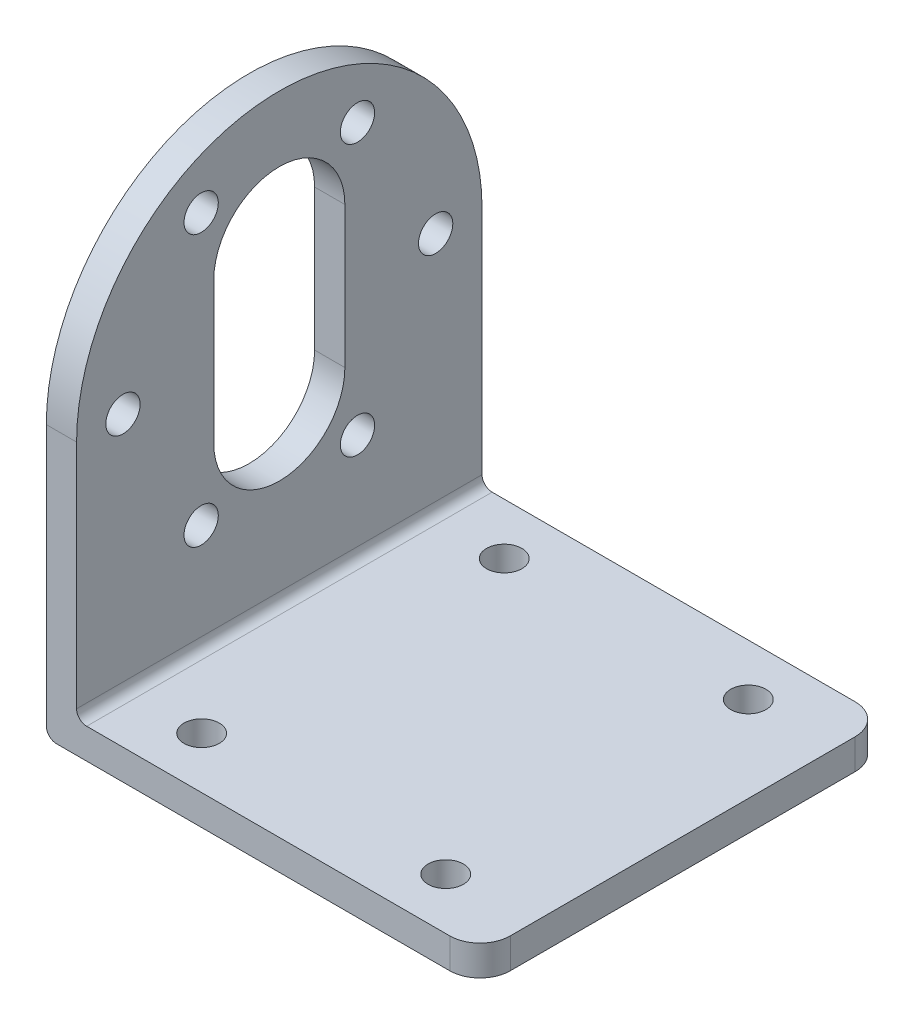
ISO-10303-21;
HEADER;
FILE_DESCRIPTION(('STEP AP214'),'2;1');
FILE_NAME('part.step','',(''),(''),'','','');
FILE_SCHEMA(('AUTOMOTIVE_DESIGN { 1 0 10303 214 1 1 1 1 }'));
ENDSEC;
DATA;
#1=APPLICATION_CONTEXT('core data for automotive mechanical design processes');
#2=APPLICATION_PROTOCOL_DEFINITION('international standard','automotive_design',2000,#1);
#3=PRODUCT_CONTEXT('',#1,'mechanical');
#4=PRODUCT('Part','Part','',(#3));
#5=PRODUCT_RELATED_PRODUCT_CATEGORY('part','',(#4));
#6=PRODUCT_DEFINITION_FORMATION('','',#4);
#7=PRODUCT_DEFINITION_CONTEXT('part definition',#1,'design');
#8=PRODUCT_DEFINITION('design','',#6,#7);
#9=PRODUCT_DEFINITION_SHAPE('','',#8);
#10=(LENGTH_UNIT() NAMED_UNIT(*) SI_UNIT(.MILLI.,.METRE.));
#11=(NAMED_UNIT(*) PLANE_ANGLE_UNIT() SI_UNIT($,.RADIAN.));
#12=(NAMED_UNIT(*) SI_UNIT($,.STERADIAN.) SOLID_ANGLE_UNIT());
#13=UNCERTAINTY_MEASURE_WITH_UNIT(LENGTH_MEASURE(1.E-05),#10,'distance_accuracy_value','');
#14=(GEOMETRIC_REPRESENTATION_CONTEXT(3) GLOBAL_UNCERTAINTY_ASSIGNED_CONTEXT((#13)) GLOBAL_UNIT_ASSIGNED_CONTEXT((#10,
#11,#12)) REPRESENTATION_CONTEXT('',''));
#15=CARTESIAN_POINT('',(0.,0.,0.));
#16=DIRECTION('',(0.,0.,1.));
#17=DIRECTION('',(1.,0.,0.));
#18=AXIS2_PLACEMENT_3D('',#15,#16,#17);
#19=CARTESIAN_POINT('',(43.,0.,0.));
#20=DIRECTION('',(0.,-1.,0.));
#21=DIRECTION('',(0.,0.,-1.));
#22=AXIS2_PLACEMENT_3D('',#19,#20,#21);
#23=PLANE('',#22);
#24=CARTESIAN_POINT('',(34.5,0.,35.1));
#25=DIRECTION('',(0.,-1.,0.));
#26=DIRECTION('',(0.,0.,-1.));
#27=AXIS2_PLACEMENT_3D('',#24,#25,#26);
#28=CIRCLE('',#27,1.75);
#29=CARTESIAN_POINT('',(34.5,0.,33.35));
#30=VERTEX_POINT('',#29);
#31=EDGE_CURVE('E11',#30,#30,#28,.T.);
#32=ORIENTED_EDGE('',*,*,#31,.F.);
#33=EDGE_LOOP('',(#32));
#34=FACE_BOUND('',#33,.T.);
#35=CARTESIAN_POINT('',(10.3,0.,5.09999999999999));
#36=DIRECTION('',(0.,-1.,0.));
#37=DIRECTION('',(0.,0.,-1.));
#38=AXIS2_PLACEMENT_3D('',#35,#36,#37);
#39=CIRCLE('',#38,1.75);
#40=CARTESIAN_POINT('',(10.3,0.,3.34999999999999));
#41=VERTEX_POINT('',#40);
#42=EDGE_CURVE('E24',#41,#41,#39,.T.);
#43=ORIENTED_EDGE('',*,*,#42,.F.);
#44=EDGE_LOOP('',(#43));
#45=FACE_BOUND('',#44,.T.);
#46=CARTESIAN_POINT('',(10.3,0.,35.1));
#47=DIRECTION('',(0.,-1.,0.));
#48=DIRECTION('',(0.,0.,-1.));
#49=AXIS2_PLACEMENT_3D('',#46,#47,#48);
#50=CIRCLE('',#49,1.75);
#51=CARTESIAN_POINT('',(10.3,0.,33.35));
#52=VERTEX_POINT('',#51);
#53=EDGE_CURVE('E286',#52,#52,#50,.T.);
#54=ORIENTED_EDGE('',*,*,#53,.F.);
#55=EDGE_LOOP('',(#54));
#56=FACE_BOUND('',#55,.T.);
#57=CARTESIAN_POINT('',(34.5,0.,5.1));
#58=DIRECTION('',(0.,-1.,0.));
#59=DIRECTION('',(0.,0.,-1.));
#60=AXIS2_PLACEMENT_3D('',#57,#58,#59);
#61=CIRCLE('',#60,1.75);
#62=CARTESIAN_POINT('',(34.5,0.,3.35));
#63=VERTEX_POINT('',#62);
#64=EDGE_CURVE('E283',#63,#63,#61,.T.);
#65=ORIENTED_EDGE('',*,*,#64,.F.);
#66=EDGE_LOOP('',(#65));
#67=FACE_BOUND('',#66,.T.);
#68=DIRECTION('',(0.,0.,1.));
#69=VECTOR('',#68,1.);
#70=CARTESIAN_POINT('',(43.,0.,0.));
#71=LINE('',#70,#69);
#72=CARTESIAN_POINT('',(43.,0.,3.));
#73=VERTEX_POINT('',#72);
#74=CARTESIAN_POINT('',(43.,0.,37.2));
#75=VERTEX_POINT('',#74);
#76=EDGE_CURVE('E31',#73,#75,#71,.T.);
#77=ORIENTED_EDGE('',*,*,#76,.T.);
#78=CARTESIAN_POINT('',(40.,0.,37.2));
#79=DIRECTION('',(0.,-1.,0.));
#80=DIRECTION('',(0.,0.,-1.));
#81=AXIS2_PLACEMENT_3D('',#78,#79,#80);
#82=CIRCLE('',#81,3.);
#83=CARTESIAN_POINT('',(40.,0.,40.2));
#84=VERTEX_POINT('',#83);
#85=EDGE_CURVE('E36',#75,#84,#82,.T.);
#86=ORIENTED_EDGE('',*,*,#85,.T.);
#87=DIRECTION('',(-1.,0.,0.));
#88=VECTOR('',#87,1.);
#89=CARTESIAN_POINT('',(43.,0.,40.2));
#90=LINE('',#89,#88);
#91=CARTESIAN_POINT('',(1.,0.,40.2));
#92=VERTEX_POINT('',#91);
#93=EDGE_CURVE('E279',#84,#92,#90,.T.);
#94=ORIENTED_EDGE('',*,*,#93,.T.);
#95=DIRECTION('',(0.,0.,1.));
#96=VECTOR('',#95,1.);
#97=CARTESIAN_POINT('',(1.,0.,0.));
#98=LINE('',#97,#96);
#99=CARTESIAN_POINT('',(1.,0.,0.));
#100=VERTEX_POINT('',#99);
#101=EDGE_CURVE('E277',#92,#100,#98,.F.);
#102=ORIENTED_EDGE('',*,*,#101,.T.);
#103=DIRECTION('',(-1.,0.,0.));
#104=VECTOR('',#103,1.);
#105=CARTESIAN_POINT('',(43.,0.,0.));
#106=LINE('',#105,#104);
#107=CARTESIAN_POINT('',(40.,0.,0.));
#108=VERTEX_POINT('',#107);
#109=EDGE_CURVE('E274',#108,#100,#106,.T.);
#110=ORIENTED_EDGE('',*,*,#109,.F.);
#111=CARTESIAN_POINT('',(40.,0.,3.));
#112=DIRECTION('',(0.,-1.,0.));
#113=DIRECTION('',(0.,0.,-1.));
#114=AXIS2_PLACEMENT_3D('',#111,#112,#113);
#115=CIRCLE('',#114,3.);
#116=EDGE_CURVE('E272',#108,#73,#115,.T.);
#117=ORIENTED_EDGE('',*,*,#116,.T.);
#118=EDGE_LOOP('',(#77,#86,#94,#102,#110,#117));
#119=FACE_BOUND('',#118,.T.);
#120=ADVANCED_FACE('F17',(#34,#45,#56,#67,#119),#23,.T.);
#121=CARTESIAN_POINT('',(43.,26.9,0.));
#122=DIRECTION('',(0.,0.,-1.));
#123=DIRECTION('',(-1.,0.,0.));
#124=AXIS2_PLACEMENT_3D('',#121,#122,#123);
#125=PLANE('',#124);
#126=DIRECTION('',(-1.,0.,0.));
#127=VECTOR('',#126,1.);
#128=CARTESIAN_POINT('',(59.2917047559601,3.,0.));
#129=LINE('',#128,#127);
#130=CARTESIAN_POINT('',(40.,3.,0.));
#131=VERTEX_POINT('',#130);
#132=CARTESIAN_POINT('',(4.,3.,0.));
#133=VERTEX_POINT('',#132);
#134=EDGE_CURVE('E269',#131,#133,#129,.T.);
#135=ORIENTED_EDGE('',*,*,#134,.F.);
#136=DIRECTION('',(0.,-1.,0.));
#137=VECTOR('',#136,1.);
#138=CARTESIAN_POINT('',(40.,0.,0.));
#139=LINE('',#138,#137);
#140=EDGE_CURVE('E266',#131,#108,#139,.T.);
#141=ORIENTED_EDGE('',*,*,#140,.T.);
#142=ORIENTED_EDGE('',*,*,#109,.T.);
#143=CARTESIAN_POINT('',(1.,1.,0.));
#144=DIRECTION('',(0.,0.,-1.));
#145=DIRECTION('',(-1.,0.,0.));
#146=AXIS2_PLACEMENT_3D('',#143,#144,#145);
#147=CIRCLE('',#146,1.);
#148=CARTESIAN_POINT('',(0.,1.00000000000001,0.));
#149=VERTEX_POINT('',#148);
#150=EDGE_CURVE('E264',#100,#149,#147,.T.);
#151=ORIENTED_EDGE('',*,*,#150,.T.);
#152=DIRECTION('',(0.,-1.,0.));
#153=VECTOR('',#152,1.);
#154=CARTESIAN_POINT('',(0.,26.9,0.));
#155=LINE('',#154,#153);
#156=CARTESIAN_POINT('',(0.,26.9,0.));
#157=VERTEX_POINT('',#156);
#158=EDGE_CURVE('E261',#157,#149,#155,.T.);
#159=ORIENTED_EDGE('',*,*,#158,.F.);
#160=DIRECTION('',(-1.,0.,0.));
#161=VECTOR('',#160,1.);
#162=CARTESIAN_POINT('',(43.,26.9,0.));
#163=LINE('',#162,#161);
#164=CARTESIAN_POINT('',(3.,26.9,0.));
#165=VERTEX_POINT('',#164);
#166=EDGE_CURVE('E258',#165,#157,#163,.T.);
#167=ORIENTED_EDGE('',*,*,#166,.F.);
#168=DIRECTION('',(0.,1.,0.));
#169=VECTOR('',#168,1.);
#170=CARTESIAN_POINT('',(3.,3.,0.));
#171=LINE('',#170,#169);
#172=CARTESIAN_POINT('',(3.,4.,0.));
#173=VERTEX_POINT('',#172);
#174=EDGE_CURVE('E255',#173,#165,#171,.T.);
#175=ORIENTED_EDGE('',*,*,#174,.F.);
#176=CARTESIAN_POINT('',(4.,4.,0.));
#177=DIRECTION('',(0.,0.,-1.));
#178=DIRECTION('',(-1.,0.,0.));
#179=AXIS2_PLACEMENT_3D('',#176,#177,#178);
#180=CIRCLE('',#179,1.);
#181=EDGE_CURVE('E253',#173,#133,#180,.F.);
#182=ORIENTED_EDGE('',*,*,#181,.T.);
#183=EDGE_LOOP('',(#135,#141,#142,#151,#159,#167,#175,#182));
#184=FACE_BOUND('',#183,.T.);
#185=ADVANCED_FACE('F295',(#184),#125,.T.);
#186=CARTESIAN_POINT('',(43.,26.9,20.1));
#187=DIRECTION('',(-1.,0.,0.));
#188=DIRECTION('',(0.,0.,1.));
#189=AXIS2_PLACEMENT_3D('',#186,#187,#188);
#190=CYLINDRICAL_SURFACE('',#189,20.1);
#191=CARTESIAN_POINT('',(3.,26.9,20.1));
#192=DIRECTION('',(-1.,0.,0.));
#193=DIRECTION('',(0.,-1.,0.));
#194=AXIS2_PLACEMENT_3D('',#191,#192,#193);
#195=CIRCLE('',#194,20.1);
#196=CARTESIAN_POINT('',(3.,26.9,40.2));
#197=VERTEX_POINT('',#196);
#198=EDGE_CURVE('E250',#165,#197,#195,.F.);
#199=ORIENTED_EDGE('',*,*,#198,.F.);
#200=ORIENTED_EDGE('',*,*,#166,.T.);
#201=CARTESIAN_POINT('',(0.,26.9,20.1));
#202=DIRECTION('',(-1.,0.,0.));
#203=DIRECTION('',(0.,0.,1.));
#204=AXIS2_PLACEMENT_3D('',#201,#202,#203);
#205=CIRCLE('',#204,20.1);
#206=CARTESIAN_POINT('',(0.,26.9,40.2));
#207=VERTEX_POINT('',#206);
#208=EDGE_CURVE('E247',#207,#157,#205,.T.);
#209=ORIENTED_EDGE('',*,*,#208,.F.);
#210=DIRECTION('',(-1.,0.,0.));
#211=VECTOR('',#210,1.);
#212=CARTESIAN_POINT('',(43.,26.9,40.2));
#213=LINE('',#212,#211);
#214=EDGE_CURVE('E244',#197,#207,#213,.T.);
#215=ORIENTED_EDGE('',*,*,#214,.F.);
#216=EDGE_LOOP('',(#199,#200,#209,#215));
#217=FACE_BOUND('',#216,.T.);
#218=ADVANCED_FACE('F345',(#217),#190,.T.);
#219=CARTESIAN_POINT('',(43.,0.,40.2));
#220=DIRECTION('',(0.,0.,1.));
#221=DIRECTION('',(1.,0.,0.));
#222=AXIS2_PLACEMENT_3D('',#219,#220,#221);
#223=PLANE('',#222);
#224=ORIENTED_EDGE('',*,*,#93,.F.);
#225=DIRECTION('',(0.,1.,0.));
#226=VECTOR('',#225,1.);
#227=CARTESIAN_POINT('',(40.,3.,40.2));
#228=LINE('',#227,#226);
#229=CARTESIAN_POINT('',(40.,3.,40.2));
#230=VERTEX_POINT('',#229);
#231=EDGE_CURVE('E242',#84,#230,#228,.T.);
#232=ORIENTED_EDGE('',*,*,#231,.T.);
#233=DIRECTION('',(-1.,0.,0.));
#234=VECTOR('',#233,1.);
#235=CARTESIAN_POINT('',(59.2917047559601,3.,40.2));
#236=LINE('',#235,#234);
#237=CARTESIAN_POINT('',(4.,3.,40.2));
#238=VERTEX_POINT('',#237);
#239=EDGE_CURVE('E240',#230,#238,#236,.T.);
#240=ORIENTED_EDGE('',*,*,#239,.T.);
#241=CARTESIAN_POINT('',(4.,4.,40.2));
#242=DIRECTION('',(0.,0.,1.));
#243=DIRECTION('',(1.,0.,0.));
#244=AXIS2_PLACEMENT_3D('',#241,#242,#243);
#245=CIRCLE('',#244,1.);
#246=CARTESIAN_POINT('',(3.,4.,40.2));
#247=VERTEX_POINT('',#246);
#248=EDGE_CURVE('E238',#238,#247,#245,.F.);
#249=ORIENTED_EDGE('',*,*,#248,.T.);
#250=DIRECTION('',(0.,1.,0.));
#251=VECTOR('',#250,1.);
#252=CARTESIAN_POINT('',(3.,3.,40.2));
#253=LINE('',#252,#251);
#254=EDGE_CURVE('E235',#247,#197,#253,.T.);
#255=ORIENTED_EDGE('',*,*,#254,.T.);
#256=ORIENTED_EDGE('',*,*,#214,.T.);
#257=DIRECTION('',(0.,1.,0.));
#258=VECTOR('',#257,1.);
#259=CARTESIAN_POINT('',(0.,0.,40.2));
#260=LINE('',#259,#258);
#261=CARTESIAN_POINT('',(0.,1.,40.2));
#262=VERTEX_POINT('',#261);
#263=EDGE_CURVE('E232',#262,#207,#260,.T.);
#264=ORIENTED_EDGE('',*,*,#263,.F.);
#265=CARTESIAN_POINT('',(1.,1.,40.2));
#266=DIRECTION('',(0.,0.,1.));
#267=DIRECTION('',(1.,0.,0.));
#268=AXIS2_PLACEMENT_3D('',#265,#266,#267);
#269=CIRCLE('',#268,1.);
#270=EDGE_CURVE('E229',#262,#92,#269,.T.);
#271=ORIENTED_EDGE('',*,*,#270,.T.);
#272=EDGE_LOOP('',(#224,#232,#240,#249,#255,#256,#264,#271));
#273=FACE_BOUND('',#272,.T.);
#274=ADVANCED_FACE('F341',(#273),#223,.T.);
#275=CARTESIAN_POINT('',(43.,26.9,20.1));
#276=DIRECTION('',(-1.,0.,0.));
#277=DIRECTION('',(0.,0.,1.));
#278=AXIS2_PLACEMENT_3D('',#275,#276,#277);
#279=PLANE('',#278);
#280=DIRECTION('',(0.,0.,1.));
#281=VECTOR('',#280,1.);
#282=CARTESIAN_POINT('',(43.,3.,20.1));
#283=LINE('',#282,#281);
#284=CARTESIAN_POINT('',(43.,3.,3.));
#285=VERTEX_POINT('',#284);
#286=CARTESIAN_POINT('',(43.,3.,37.2));
#287=VERTEX_POINT('',#286);
#288=EDGE_CURVE('E227',#285,#287,#283,.T.);
#289=ORIENTED_EDGE('',*,*,#288,.T.);
#290=DIRECTION('',(0.,1.,0.));
#291=VECTOR('',#290,1.);
#292=CARTESIAN_POINT('',(43.,0.,37.2));
#293=LINE('',#292,#291);
#294=EDGE_CURVE('E225',#287,#75,#293,.F.);
#295=ORIENTED_EDGE('',*,*,#294,.T.);
#296=ORIENTED_EDGE('',*,*,#76,.F.);
#297=DIRECTION('',(0.,-1.,0.));
#298=VECTOR('',#297,1.);
#299=CARTESIAN_POINT('',(43.,3.,3.));
#300=LINE('',#299,#298);
#301=EDGE_CURVE('E223',#73,#285,#300,.F.);
#302=ORIENTED_EDGE('',*,*,#301,.T.);
#303=EDGE_LOOP('',(#289,#295,#296,#302));
#304=FACE_BOUND('',#303,.T.);
#305=ADVANCED_FACE('F337',(#304),#279,.F.);
#306=CARTESIAN_POINT('',(0.,26.9,20.1));
#307=DIRECTION('',(-1.,0.,0.));
#308=DIRECTION('',(0.,0.,1.));
#309=AXIS2_PLACEMENT_3D('',#306,#307,#308);
#310=PLANE('',#309);
#311=CARTESIAN_POINT('',(0.,27.,4.6));
#312=DIRECTION('',(-1.,0.,0.));
#313=DIRECTION('',(0.,0.,1.));
#314=AXIS2_PLACEMENT_3D('',#311,#312,#313);
#315=CIRCLE('',#314,1.69999999999999);
#316=CARTESIAN_POINT('',(0.,27.,6.29999999999999));
#317=VERTEX_POINT('',#316);
#318=EDGE_CURVE('E220',#317,#317,#315,.T.);
#319=ORIENTED_EDGE('',*,*,#318,.F.);
#320=EDGE_LOOP('',(#319));
#321=FACE_BOUND('',#320,.T.);
#322=CARTESIAN_POINT('',(0.,40.4233937586588,12.35));
#323=DIRECTION('',(-1.,0.,0.));
#324=DIRECTION('',(0.,0.,1.));
#325=AXIS2_PLACEMENT_3D('',#322,#323,#324);
#326=CIRCLE('',#325,1.69999999999999);
#327=CARTESIAN_POINT('',(0.,40.4233937586588,14.05));
#328=VERTEX_POINT('',#327);
#329=EDGE_CURVE('E217',#328,#328,#326,.T.);
#330=ORIENTED_EDGE('',*,*,#329,.F.);
#331=EDGE_LOOP('',(#330));
#332=FACE_BOUND('',#331,.T.);
#333=CARTESIAN_POINT('',(0.,40.4233937586588,27.8500000000001));
#334=DIRECTION('',(-1.,0.,0.));
#335=DIRECTION('',(0.,0.,1.));
#336=AXIS2_PLACEMENT_3D('',#333,#334,#335);
#337=CIRCLE('',#336,1.69999999999999);
#338=CARTESIAN_POINT('',(0.,40.4233937586588,29.5500000000001));
#339=VERTEX_POINT('',#338);
#340=EDGE_CURVE('E214',#339,#339,#337,.T.);
#341=ORIENTED_EDGE('',*,*,#340,.F.);
#342=EDGE_LOOP('',(#341));
#343=FACE_BOUND('',#342,.T.);
#344=CARTESIAN_POINT('',(0.,26.9999999999999,35.6));
#345=DIRECTION('',(-1.,0.,0.));
#346=DIRECTION('',(0.,0.,1.));
#347=AXIS2_PLACEMENT_3D('',#344,#345,#346);
#348=CIRCLE('',#347,1.69999999999999);
#349=CARTESIAN_POINT('',(0.,26.9999999999999,37.3));
#350=VERTEX_POINT('',#349);
#351=EDGE_CURVE('E211',#350,#350,#348,.T.);
#352=ORIENTED_EDGE('',*,*,#351,.F.);
#353=EDGE_LOOP('',(#352));
#354=FACE_BOUND('',#353,.T.);
#355=CARTESIAN_POINT('',(0.,13.5766062413411,27.8499999999999));
#356=DIRECTION('',(-1.,0.,0.));
#357=DIRECTION('',(0.,0.,1.));
#358=AXIS2_PLACEMENT_3D('',#355,#356,#357);
#359=CIRCLE('',#358,1.69999999999999);
#360=CARTESIAN_POINT('',(0.,13.5766062413411,29.5499999999999));
#361=VERTEX_POINT('',#360);
#362=EDGE_CURVE('E208',#361,#361,#359,.T.);
#363=ORIENTED_EDGE('',*,*,#362,.F.);
#364=EDGE_LOOP('',(#363));
#365=FACE_BOUND('',#364,.T.);
#366=CARTESIAN_POINT('',(0.,13.5766062413413,12.3499999999998));
#367=DIRECTION('',(-1.,0.,0.));
#368=DIRECTION('',(0.,0.,1.));
#369=AXIS2_PLACEMENT_3D('',#366,#367,#368);
#370=CIRCLE('',#369,1.69999999999999);
#371=CARTESIAN_POINT('',(0.,13.5766062413413,14.0499999999998));
#372=VERTEX_POINT('',#371);
#373=EDGE_CURVE('E205',#372,#372,#370,.T.);
#374=ORIENTED_EDGE('',*,*,#373,.F.);
#375=EDGE_LOOP('',(#374));
#376=FACE_BOUND('',#375,.T.);
#377=CARTESIAN_POINT('',(0.,34.,20.1));
#378=DIRECTION('',(-1.,0.,0.));
#379=DIRECTION('',(0.,0.,1.));
#380=AXIS2_PLACEMENT_3D('',#377,#378,#379);
#381=CIRCLE('',#380,6.5);
#382=CARTESIAN_POINT('',(0.,34.,26.6));
#383=VERTEX_POINT('',#382);
#384=CARTESIAN_POINT('',(0.,34.,13.6));
#385=VERTEX_POINT('',#384);
#386=EDGE_CURVE('E202',#383,#385,#381,.T.);
#387=ORIENTED_EDGE('',*,*,#386,.F.);
#388=DIRECTION('',(0.,1.,0.));
#389=VECTOR('',#388,1.);
#390=CARTESIAN_POINT('',(0.,20.,26.6));
#391=LINE('',#390,#389);
#392=CARTESIAN_POINT('',(0.,20.,26.6));
#393=VERTEX_POINT('',#392);
#394=EDGE_CURVE('E200',#393,#383,#391,.T.);
#395=ORIENTED_EDGE('',*,*,#394,.F.);
#396=CARTESIAN_POINT('',(0.,20.,20.1));
#397=DIRECTION('',(-1.,0.,0.));
#398=DIRECTION('',(0.,0.,1.));
#399=AXIS2_PLACEMENT_3D('',#396,#397,#398);
#400=CIRCLE('',#399,6.5);
#401=CARTESIAN_POINT('',(0.,20.,13.6));
#402=VERTEX_POINT('',#401);
#403=EDGE_CURVE('E142',#402,#393,#400,.T.);
#404=ORIENTED_EDGE('',*,*,#403,.F.);
#405=DIRECTION('',(0.,-1.,0.));
#406=VECTOR('',#405,1.);
#407=CARTESIAN_POINT('',(0.,34.,13.6));
#408=LINE('',#407,#406);
#409=EDGE_CURVE('E196',#385,#402,#408,.T.);
#410=ORIENTED_EDGE('',*,*,#409,.F.);
#411=EDGE_LOOP('',(#387,#395,#404,#410));
#412=FACE_BOUND('',#411,.T.);
#413=ORIENTED_EDGE('',*,*,#158,.T.);
#414=DIRECTION('',(0.,0.,1.));
#415=VECTOR('',#414,1.);
#416=CARTESIAN_POINT('',(0.,1.,20.1));
#417=LINE('',#416,#415);
#418=EDGE_CURVE('E193',#149,#262,#417,.T.);
#419=ORIENTED_EDGE('',*,*,#418,.T.);
#420=ORIENTED_EDGE('',*,*,#263,.T.);
#421=ORIENTED_EDGE('',*,*,#208,.T.);
#422=EDGE_LOOP('',(#413,#419,#420,#421));
#423=FACE_BOUND('',#422,.T.);
#424=ADVANCED_FACE('F333',(#321,#332,#343,#354,#365,#376,#412,#423),#310,.T.);
#425=CARTESIAN_POINT('',(59.2917047559601,3.,40.2));
#426=DIRECTION('',(0.,-1.,0.));
#427=DIRECTION('',(0.,0.,-1.));
#428=AXIS2_PLACEMENT_3D('',#425,#426,#427);
#429=PLANE('',#428);
#430=CARTESIAN_POINT('',(34.5,3.,35.1));
#431=DIRECTION('',(0.,-1.,0.));
#432=DIRECTION('',(0.,0.,-1.));
#433=AXIS2_PLACEMENT_3D('',#430,#431,#432);
#434=CIRCLE('',#433,1.75);
#435=CARTESIAN_POINT('',(34.5,3.,33.35));
#436=VERTEX_POINT('',#435);
#437=EDGE_CURVE('E190',#436,#436,#434,.T.);
#438=ORIENTED_EDGE('',*,*,#437,.T.);
#439=EDGE_LOOP('',(#438));
#440=FACE_BOUND('',#439,.T.);
#441=CARTESIAN_POINT('',(10.3,3.,5.09999999999999));
#442=DIRECTION('',(0.,-1.,0.));
#443=DIRECTION('',(0.,0.,-1.));
#444=AXIS2_PLACEMENT_3D('',#441,#442,#443);
#445=CIRCLE('',#444,1.75);
#446=CARTESIAN_POINT('',(10.3,3.,3.34999999999999));
#447=VERTEX_POINT('',#446);
#448=EDGE_CURVE('E187',#447,#447,#445,.T.);
#449=ORIENTED_EDGE('',*,*,#448,.T.);
#450=EDGE_LOOP('',(#449));
#451=FACE_BOUND('',#450,.T.);
#452=CARTESIAN_POINT('',(10.3,3.,35.1));
#453=DIRECTION('',(0.,-1.,0.));
#454=DIRECTION('',(0.,0.,-1.));
#455=AXIS2_PLACEMENT_3D('',#452,#453,#454);
#456=CIRCLE('',#455,1.75);
#457=CARTESIAN_POINT('',(10.3,3.,33.35));
#458=VERTEX_POINT('',#457);
#459=EDGE_CURVE('E184',#458,#458,#456,.T.);
#460=ORIENTED_EDGE('',*,*,#459,.T.);
#461=EDGE_LOOP('',(#460));
#462=FACE_BOUND('',#461,.T.);
#463=CARTESIAN_POINT('',(34.5,3.,5.1));
#464=DIRECTION('',(0.,-1.,0.));
#465=DIRECTION('',(0.,0.,-1.));
#466=AXIS2_PLACEMENT_3D('',#463,#464,#465);
#467=CIRCLE('',#466,1.75);
#468=CARTESIAN_POINT('',(34.5,3.,3.35));
#469=VERTEX_POINT('',#468);
#470=EDGE_CURVE('E181',#469,#469,#467,.T.);
#471=ORIENTED_EDGE('',*,*,#470,.T.);
#472=EDGE_LOOP('',(#471));
#473=FACE_BOUND('',#472,.T.);
#474=ORIENTED_EDGE('',*,*,#239,.F.);
#475=CARTESIAN_POINT('',(40.,3.,37.2));
#476=DIRECTION('',(0.,-1.,0.));
#477=DIRECTION('',(0.,0.,-1.));
#478=AXIS2_PLACEMENT_3D('',#475,#476,#477);
#479=CIRCLE('',#478,3.);
#480=EDGE_CURVE('E178',#230,#287,#479,.F.);
#481=ORIENTED_EDGE('',*,*,#480,.T.);
#482=ORIENTED_EDGE('',*,*,#288,.F.);
#483=CARTESIAN_POINT('',(40.,3.,3.));
#484=DIRECTION('',(0.,-1.,0.));
#485=DIRECTION('',(0.,0.,-1.));
#486=AXIS2_PLACEMENT_3D('',#483,#484,#485);
#487=CIRCLE('',#486,3.);
#488=EDGE_CURVE('E175',#285,#131,#487,.F.);
#489=ORIENTED_EDGE('',*,*,#488,.T.);
#490=ORIENTED_EDGE('',*,*,#134,.T.);
#491=DIRECTION('',(0.,0.,-1.));
#492=VECTOR('',#491,1.);
#493=CARTESIAN_POINT('',(4.,3.,40.2));
#494=LINE('',#493,#492);
#495=EDGE_CURVE('E172',#133,#238,#494,.F.);
#496=ORIENTED_EDGE('',*,*,#495,.T.);
#497=EDGE_LOOP('',(#474,#481,#482,#489,#490,#496));
#498=FACE_BOUND('',#497,.T.);
#499=ADVANCED_FACE('F329',(#440,#451,#462,#473,#498),#429,.F.);
#500=CARTESIAN_POINT('',(3.,3.,40.2));
#501=DIRECTION('',(-1.,0.,0.));
#502=DIRECTION('',(0.,-1.,0.));
#503=AXIS2_PLACEMENT_3D('',#500,#501,#502);
#504=PLANE('',#503);
#505=CARTESIAN_POINT('',(3.,27.,4.6));
#506=DIRECTION('',(-1.,0.,0.));
#507=DIRECTION('',(0.,-1.,0.));
#508=AXIS2_PLACEMENT_3D('',#505,#506,#507);
#509=CIRCLE('',#508,1.69999999999999);
#510=CARTESIAN_POINT('',(3.,25.3,4.6));
#511=VERTEX_POINT('',#510);
#512=EDGE_CURVE('E169',#511,#511,#509,.T.);
#513=ORIENTED_EDGE('',*,*,#512,.T.);
#514=EDGE_LOOP('',(#513));
#515=FACE_BOUND('',#514,.T.);
#516=CARTESIAN_POINT('',(3.,40.4233937586588,12.35));
#517=DIRECTION('',(-1.,0.,0.));
#518=DIRECTION('',(0.,-1.,0.));
#519=AXIS2_PLACEMENT_3D('',#516,#517,#518);
#520=CIRCLE('',#519,1.69999999999999);
#521=CARTESIAN_POINT('',(3.,38.7233937586588,12.35));
#522=VERTEX_POINT('',#521);
#523=EDGE_CURVE('E166',#522,#522,#520,.T.);
#524=ORIENTED_EDGE('',*,*,#523,.T.);
#525=EDGE_LOOP('',(#524));
#526=FACE_BOUND('',#525,.T.);
#527=CARTESIAN_POINT('',(3.,40.4233937586588,27.8500000000001));
#528=DIRECTION('',(-1.,0.,0.));
#529=DIRECTION('',(0.,-1.,0.));
#530=AXIS2_PLACEMENT_3D('',#527,#528,#529);
#531=CIRCLE('',#530,1.69999999999999);
#532=CARTESIAN_POINT('',(3.,38.7233937586588,27.8500000000001));
#533=VERTEX_POINT('',#532);
#534=EDGE_CURVE('E163',#533,#533,#531,.T.);
#535=ORIENTED_EDGE('',*,*,#534,.T.);
#536=EDGE_LOOP('',(#535));
#537=FACE_BOUND('',#536,.T.);
#538=CARTESIAN_POINT('',(3.,26.9999999999999,35.6));
#539=DIRECTION('',(-1.,0.,0.));
#540=DIRECTION('',(0.,-1.,0.));
#541=AXIS2_PLACEMENT_3D('',#538,#539,#540);
#542=CIRCLE('',#541,1.69999999999999);
#543=CARTESIAN_POINT('',(3.,25.2999999999999,35.6));
#544=VERTEX_POINT('',#543);
#545=EDGE_CURVE('E160',#544,#544,#542,.T.);
#546=ORIENTED_EDGE('',*,*,#545,.T.);
#547=EDGE_LOOP('',(#546));
#548=FACE_BOUND('',#547,.T.);
#549=CARTESIAN_POINT('',(3.,13.5766062413411,27.8499999999999));
#550=DIRECTION('',(-1.,0.,0.));
#551=DIRECTION('',(0.,-1.,0.));
#552=AXIS2_PLACEMENT_3D('',#549,#550,#551);
#553=CIRCLE('',#552,1.69999999999999);
#554=CARTESIAN_POINT('',(3.,11.8766062413411,27.8499999999999));
#555=VERTEX_POINT('',#554);
#556=EDGE_CURVE('E157',#555,#555,#553,.T.);
#557=ORIENTED_EDGE('',*,*,#556,.T.);
#558=EDGE_LOOP('',(#557));
#559=FACE_BOUND('',#558,.T.);
#560=CARTESIAN_POINT('',(3.,13.5766062413413,12.3499999999998));
#561=DIRECTION('',(-1.,0.,0.));
#562=DIRECTION('',(0.,-1.,0.));
#563=AXIS2_PLACEMENT_3D('',#560,#561,#562);
#564=CIRCLE('',#563,1.69999999999999);
#565=CARTESIAN_POINT('',(3.,11.8766062413413,12.3499999999998));
#566=VERTEX_POINT('',#565);
#567=EDGE_CURVE('E138',#566,#566,#564,.T.);
#568=ORIENTED_EDGE('',*,*,#567,.T.);
#569=EDGE_LOOP('',(#568));
#570=FACE_BOUND('',#569,.T.);
#571=DIRECTION('',(0.,1.,0.));
#572=VECTOR('',#571,1.);
#573=CARTESIAN_POINT('',(3.,3.00000000000001,26.6));
#574=LINE('',#573,#572);
#575=CARTESIAN_POINT('',(3.,20.,26.6));
#576=VERTEX_POINT('',#575);
#577=CARTESIAN_POINT('',(3.,34.,26.6));
#578=VERTEX_POINT('',#577);
#579=EDGE_CURVE('E119',#576,#578,#574,.T.);
#580=ORIENTED_EDGE('',*,*,#579,.T.);
#581=CARTESIAN_POINT('',(3.,34.,20.1));
#582=DIRECTION('',(-1.,0.,0.));
#583=DIRECTION('',(0.,-1.,0.));
#584=AXIS2_PLACEMENT_3D('',#581,#582,#583);
#585=CIRCLE('',#584,6.5);
#586=CARTESIAN_POINT('',(3.,34.,13.6));
#587=VERTEX_POINT('',#586);
#588=EDGE_CURVE('E139',#578,#587,#585,.T.);
#589=ORIENTED_EDGE('',*,*,#588,.T.);
#590=DIRECTION('',(0.,-1.,0.));
#591=VECTOR('',#590,1.);
#592=CARTESIAN_POINT('',(3.,2.99999999999999,13.6));
#593=LINE('',#592,#591);
#594=CARTESIAN_POINT('',(3.,20.,13.6));
#595=VERTEX_POINT('',#594);
#596=EDGE_CURVE('E122',#587,#595,#593,.T.);
#597=ORIENTED_EDGE('',*,*,#596,.T.);
#598=CARTESIAN_POINT('',(3.,20.,20.1));
#599=DIRECTION('',(-1.,0.,0.));
#600=DIRECTION('',(0.,-1.,0.));
#601=AXIS2_PLACEMENT_3D('',#598,#599,#600);
#602=CIRCLE('',#601,6.5);
#603=EDGE_CURVE('E115',#595,#576,#602,.T.);
#604=ORIENTED_EDGE('',*,*,#603,.T.);
#605=EDGE_LOOP('',(#580,#589,#597,#604));
#606=FACE_BOUND('',#605,.T.);
#607=ORIENTED_EDGE('',*,*,#254,.F.);
#608=DIRECTION('',(0.,0.,-1.));
#609=VECTOR('',#608,1.);
#610=CARTESIAN_POINT('',(3.,4.,0.));
#611=LINE('',#610,#609);
#612=EDGE_CURVE('E127',#247,#173,#611,.T.);
#613=ORIENTED_EDGE('',*,*,#612,.T.);
#614=ORIENTED_EDGE('',*,*,#174,.T.);
#615=ORIENTED_EDGE('',*,*,#198,.T.);
#616=EDGE_LOOP('',(#607,#613,#614,#615));
#617=FACE_BOUND('',#616,.T.);
#618=ADVANCED_FACE('F117',(#515,#526,#537,#548,#559,#570,#606,#617),#504,.F.);
#619=CARTESIAN_POINT('',(43.,34.,20.1));
#620=DIRECTION('',(-1.,0.,0.));
#621=DIRECTION('',(0.,0.,1.));
#622=AXIS2_PLACEMENT_3D('',#619,#620,#621);
#623=CYLINDRICAL_SURFACE('',#622,6.5);
#624=DIRECTION('',(-1.,0.,0.));
#625=VECTOR('',#624,1.);
#626=CARTESIAN_POINT('',(43.,34.,26.6));
#627=LINE('',#626,#625);
#628=EDGE_CURVE('E137',#578,#383,#627,.T.);
#629=ORIENTED_EDGE('',*,*,#628,.T.);
#630=ORIENTED_EDGE('',*,*,#386,.T.);
#631=DIRECTION('',(-1.,0.,0.));
#632=VECTOR('',#631,1.);
#633=CARTESIAN_POINT('',(43.,34.,13.6));
#634=LINE('',#633,#632);
#635=EDGE_CURVE('E143',#587,#385,#634,.T.);
#636=ORIENTED_EDGE('',*,*,#635,.F.);
#637=ORIENTED_EDGE('',*,*,#588,.F.);
#638=EDGE_LOOP('',(#629,#630,#636,#637));
#639=FACE_BOUND('',#638,.T.);
#640=ADVANCED_FACE('F323',(#639),#623,.F.);
#641=CARTESIAN_POINT('',(43.,20.,26.6));
#642=DIRECTION('',(0.,0.,1.));
#643=DIRECTION('',(0.,-1.,0.));
#644=AXIS2_PLACEMENT_3D('',#641,#642,#643);
#645=PLANE('',#644);
#646=DIRECTION('',(-1.,0.,0.));
#647=VECTOR('',#646,1.);
#648=CARTESIAN_POINT('',(43.,20.,26.6));
#649=LINE('',#648,#647);
#650=EDGE_CURVE('E134',#576,#393,#649,.T.);
#651=ORIENTED_EDGE('',*,*,#650,.T.);
#652=ORIENTED_EDGE('',*,*,#394,.T.);
#653=ORIENTED_EDGE('',*,*,#628,.F.);
#654=ORIENTED_EDGE('',*,*,#579,.F.);
#655=EDGE_LOOP('',(#651,#652,#653,#654));
#656=FACE_BOUND('',#655,.T.);
#657=ADVANCED_FACE('F132',(#656),#645,.F.);
#658=CARTESIAN_POINT('',(43.,20.,20.1));
#659=DIRECTION('',(-1.,0.,0.));
#660=DIRECTION('',(0.,0.,1.));
#661=AXIS2_PLACEMENT_3D('',#658,#659,#660);
#662=CYLINDRICAL_SURFACE('',#661,6.5);
#663=DIRECTION('',(-1.,0.,0.));
#664=VECTOR('',#663,1.);
#665=CARTESIAN_POINT('',(43.,20.,13.6));
#666=LINE('',#665,#664);
#667=EDGE_CURVE('E144',#595,#402,#666,.T.);
#668=ORIENTED_EDGE('',*,*,#667,.T.);
#669=ORIENTED_EDGE('',*,*,#403,.T.);
#670=ORIENTED_EDGE('',*,*,#650,.F.);
#671=ORIENTED_EDGE('',*,*,#603,.F.);
#672=EDGE_LOOP('',(#668,#669,#670,#671));
#673=FACE_BOUND('',#672,.T.);
#674=ADVANCED_FACE('F141',(#673),#662,.F.);
#675=CARTESIAN_POINT('',(43.,34.,13.6));
#676=DIRECTION('',(0.,0.,-1.));
#677=DIRECTION('',(0.,1.,0.));
#678=AXIS2_PLACEMENT_3D('',#675,#676,#677);
#679=PLANE('',#678);
#680=ORIENTED_EDGE('',*,*,#635,.T.);
#681=ORIENTED_EDGE('',*,*,#409,.T.);
#682=ORIENTED_EDGE('',*,*,#667,.F.);
#683=ORIENTED_EDGE('',*,*,#596,.F.);
#684=EDGE_LOOP('',(#680,#681,#682,#683));
#685=FACE_BOUND('',#684,.T.);
#686=ADVANCED_FACE('F304',(#685),#679,.F.);
#687=CARTESIAN_POINT('',(34.5,0.,5.1));
#688=DIRECTION('',(0.,-1.,0.));
#689=DIRECTION('',(0.,0.,-1.));
#690=AXIS2_PLACEMENT_3D('',#687,#688,#689);
#691=CYLINDRICAL_SURFACE('',#690,1.75);
#692=ORIENTED_EDGE('',*,*,#470,.F.);
#693=EDGE_LOOP('',(#692));
#694=FACE_BOUND('',#693,.T.);
#695=ORIENTED_EDGE('',*,*,#64,.T.);
#696=EDGE_LOOP('',(#695));
#697=FACE_BOUND('',#696,.T.);
#698=ADVANCED_FACE('F301',(#694,#697),#691,.F.);
#699=CARTESIAN_POINT('',(10.3,0.,35.1));
#700=DIRECTION('',(0.,-1.,0.));
#701=DIRECTION('',(0.,0.,-1.));
#702=AXIS2_PLACEMENT_3D('',#699,#700,#701);
#703=CYLINDRICAL_SURFACE('',#702,1.75);
#704=ORIENTED_EDGE('',*,*,#459,.F.);
#705=EDGE_LOOP('',(#704));
#706=FACE_BOUND('',#705,.T.);
#707=ORIENTED_EDGE('',*,*,#53,.T.);
#708=EDGE_LOOP('',(#707));
#709=FACE_BOUND('',#708,.T.);
#710=ADVANCED_FACE('F303',(#706,#709),#703,.F.);
#711=CARTESIAN_POINT('',(10.3,0.,5.09999999999999));
#712=DIRECTION('',(0.,-1.,0.));
#713=DIRECTION('',(0.,0.,-1.));
#714=AXIS2_PLACEMENT_3D('',#711,#712,#713);
#715=CYLINDRICAL_SURFACE('',#714,1.75);
#716=ORIENTED_EDGE('',*,*,#448,.F.);
#717=EDGE_LOOP('',(#716));
#718=FACE_BOUND('',#717,.T.);
#719=ORIENTED_EDGE('',*,*,#42,.T.);
#720=EDGE_LOOP('',(#719));
#721=FACE_BOUND('',#720,.T.);
#722=ADVANCED_FACE('F291',(#718,#721),#715,.F.);
#723=CARTESIAN_POINT('',(34.5,0.,35.1));
#724=DIRECTION('',(0.,-1.,0.));
#725=DIRECTION('',(0.,0.,-1.));
#726=AXIS2_PLACEMENT_3D('',#723,#724,#725);
#727=CYLINDRICAL_SURFACE('',#726,1.75);
#728=ORIENTED_EDGE('',*,*,#437,.F.);
#729=EDGE_LOOP('',(#728));
#730=FACE_BOUND('',#729,.T.);
#731=ORIENTED_EDGE('',*,*,#31,.T.);
#732=EDGE_LOOP('',(#731));
#733=FACE_BOUND('',#732,.T.);
#734=ADVANCED_FACE('F416',(#730,#733),#727,.F.);
#735=CARTESIAN_POINT('',(0.,13.5766062413413,12.3499999999998));
#736=DIRECTION('',(-1.,0.,0.));
#737=DIRECTION('',(0.,0.,1.));
#738=AXIS2_PLACEMENT_3D('',#735,#736,#737);
#739=CYLINDRICAL_SURFACE('',#738,1.69999999999999);
#740=ORIENTED_EDGE('',*,*,#373,.T.);
#741=EDGE_LOOP('',(#740));
#742=FACE_BOUND('',#741,.T.);
#743=ORIENTED_EDGE('',*,*,#567,.F.);
#744=EDGE_LOOP('',(#743));
#745=FACE_BOUND('',#744,.T.);
#746=ADVANCED_FACE('F412',(#742,#745),#739,.F.);
#747=CARTESIAN_POINT('',(0.,13.5766062413411,27.8499999999999));
#748=DIRECTION('',(-1.,0.,0.));
#749=DIRECTION('',(0.,0.,1.));
#750=AXIS2_PLACEMENT_3D('',#747,#748,#749);
#751=CYLINDRICAL_SURFACE('',#750,1.69999999999999);
#752=ORIENTED_EDGE('',*,*,#362,.T.);
#753=EDGE_LOOP('',(#752));
#754=FACE_BOUND('',#753,.T.);
#755=ORIENTED_EDGE('',*,*,#556,.F.);
#756=EDGE_LOOP('',(#755));
#757=FACE_BOUND('',#756,.T.);
#758=ADVANCED_FACE('F408',(#754,#757),#751,.F.);
#759=CARTESIAN_POINT('',(0.,26.9999999999999,35.6));
#760=DIRECTION('',(-1.,0.,0.));
#761=DIRECTION('',(0.,0.,1.));
#762=AXIS2_PLACEMENT_3D('',#759,#760,#761);
#763=CYLINDRICAL_SURFACE('',#762,1.69999999999999);
#764=ORIENTED_EDGE('',*,*,#351,.T.);
#765=EDGE_LOOP('',(#764));
#766=FACE_BOUND('',#765,.T.);
#767=ORIENTED_EDGE('',*,*,#545,.F.);
#768=EDGE_LOOP('',(#767));
#769=FACE_BOUND('',#768,.T.);
#770=ADVANCED_FACE('F404',(#766,#769),#763,.F.);
#771=CARTESIAN_POINT('',(0.,40.4233937586588,27.8500000000001));
#772=DIRECTION('',(-1.,0.,0.));
#773=DIRECTION('',(0.,0.,1.));
#774=AXIS2_PLACEMENT_3D('',#771,#772,#773);
#775=CYLINDRICAL_SURFACE('',#774,1.69999999999999);
#776=ORIENTED_EDGE('',*,*,#340,.T.);
#777=EDGE_LOOP('',(#776));
#778=FACE_BOUND('',#777,.T.);
#779=ORIENTED_EDGE('',*,*,#534,.F.);
#780=EDGE_LOOP('',(#779));
#781=FACE_BOUND('',#780,.T.);
#782=ADVANCED_FACE('F400',(#778,#781),#775,.F.);
#783=CARTESIAN_POINT('',(0.,40.4233937586588,12.35));
#784=DIRECTION('',(-1.,0.,0.));
#785=DIRECTION('',(0.,0.,1.));
#786=AXIS2_PLACEMENT_3D('',#783,#784,#785);
#787=CYLINDRICAL_SURFACE('',#786,1.69999999999999);
#788=ORIENTED_EDGE('',*,*,#329,.T.);
#789=EDGE_LOOP('',(#788));
#790=FACE_BOUND('',#789,.T.);
#791=ORIENTED_EDGE('',*,*,#523,.F.);
#792=EDGE_LOOP('',(#791));
#793=FACE_BOUND('',#792,.T.);
#794=ADVANCED_FACE('F396',(#790,#793),#787,.F.);
#795=CARTESIAN_POINT('',(0.,27.,4.6));
#796=DIRECTION('',(-1.,0.,0.));
#797=DIRECTION('',(0.,0.,1.));
#798=AXIS2_PLACEMENT_3D('',#795,#796,#797);
#799=CYLINDRICAL_SURFACE('',#798,1.69999999999999);
#800=ORIENTED_EDGE('',*,*,#318,.T.);
#801=EDGE_LOOP('',(#800));
#802=FACE_BOUND('',#801,.T.);
#803=ORIENTED_EDGE('',*,*,#512,.F.);
#804=EDGE_LOOP('',(#803));
#805=FACE_BOUND('',#804,.T.);
#806=ADVANCED_FACE('F390',(#802,#805),#799,.F.);
#807=CARTESIAN_POINT('',(4.,4.,40.2));
#808=DIRECTION('',(0.,0.,1.));
#809=DIRECTION('',(1.,0.,0.));
#810=AXIS2_PLACEMENT_3D('',#807,#808,#809);
#811=CYLINDRICAL_SURFACE('',#810,1.);
#812=ORIENTED_EDGE('',*,*,#248,.F.);
#813=ORIENTED_EDGE('',*,*,#495,.F.);
#814=ORIENTED_EDGE('',*,*,#181,.F.);
#815=ORIENTED_EDGE('',*,*,#612,.F.);
#816=EDGE_LOOP('',(#812,#813,#814,#815));
#817=FACE_BOUND('',#816,.T.);
#818=ADVANCED_FACE('F373',(#817),#811,.F.);
#819=CARTESIAN_POINT('',(1.,1.,20.1));
#820=DIRECTION('',(0.,0.,1.));
#821=DIRECTION('',(1.,0.,0.));
#822=AXIS2_PLACEMENT_3D('',#819,#820,#821);
#823=CYLINDRICAL_SURFACE('',#822,1.);
#824=ORIENTED_EDGE('',*,*,#150,.F.);
#825=ORIENTED_EDGE('',*,*,#101,.F.);
#826=ORIENTED_EDGE('',*,*,#270,.F.);
#827=ORIENTED_EDGE('',*,*,#418,.F.);
#828=EDGE_LOOP('',(#824,#825,#826,#827));
#829=FACE_BOUND('',#828,.T.);
#830=ADVANCED_FACE('F382',(#829),#823,.T.);
#831=CARTESIAN_POINT('',(40.,0.,37.2));
#832=DIRECTION('',(0.,-1.,0.));
#833=DIRECTION('',(0.,0.,-1.));
#834=AXIS2_PLACEMENT_3D('',#831,#832,#833);
#835=CYLINDRICAL_SURFACE('',#834,3.);
#836=ORIENTED_EDGE('',*,*,#85,.F.);
#837=ORIENTED_EDGE('',*,*,#294,.F.);
#838=ORIENTED_EDGE('',*,*,#480,.F.);
#839=ORIENTED_EDGE('',*,*,#231,.F.);
#840=EDGE_LOOP('',(#836,#837,#838,#839));
#841=FACE_BOUND('',#840,.T.);
#842=ADVANCED_FACE('F369',(#841),#835,.T.);
#843=CARTESIAN_POINT('',(40.,26.9,3.));
#844=DIRECTION('',(0.,1.,0.));
#845=DIRECTION('',(0.,0.,1.));
#846=AXIS2_PLACEMENT_3D('',#843,#844,#845);
#847=CYLINDRICAL_SURFACE('',#846,3.);
#848=ORIENTED_EDGE('',*,*,#488,.F.);
#849=ORIENTED_EDGE('',*,*,#301,.F.);
#850=ORIENTED_EDGE('',*,*,#116,.F.);
#851=ORIENTED_EDGE('',*,*,#140,.F.);
#852=EDGE_LOOP('',(#848,#849,#850,#851));
#853=FACE_BOUND('',#852,.T.);
#854=ADVANCED_FACE('F364',(#853),#847,.T.);
#855=CLOSED_SHELL('',(#120,#185,#218,#274,#305,#424,#499,#618,#640,#657,#674,#686,#698,#710,
#722,#734,#746,#758,#770,#782,#794,#806,#818,#830,#842,#854));
#856=MANIFOLD_SOLID_BREP('B1',#855);
#857=ADVANCED_BREP_SHAPE_REPRESENTATION('',(#18,#856),#14);
#858=SHAPE_DEFINITION_REPRESENTATION(#9,#857);
ENDSEC;
END-ISO-10303-21;
